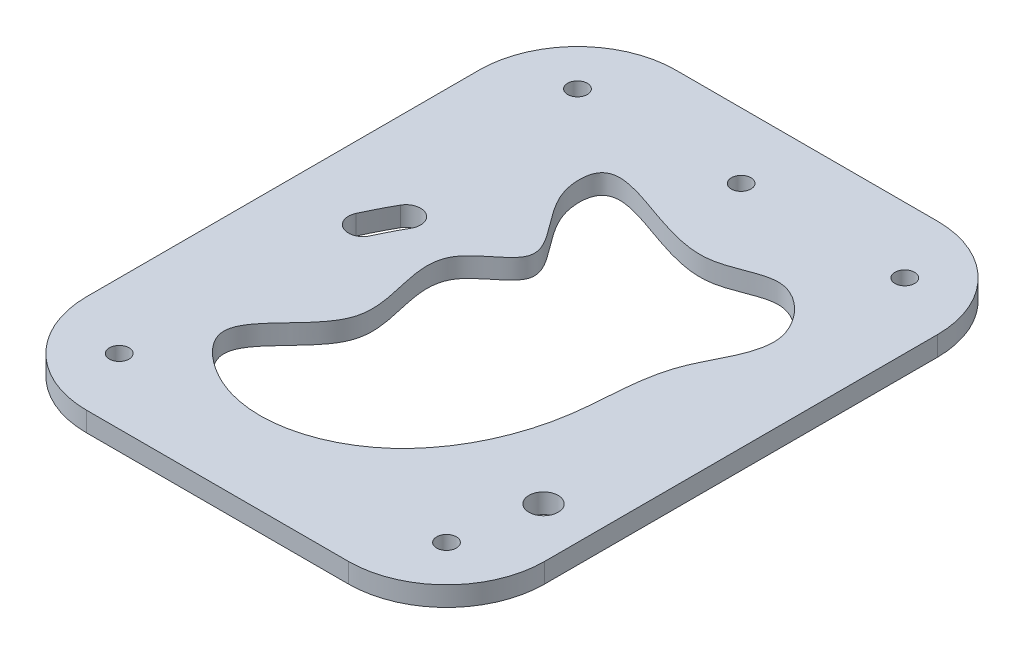
ISO-10303-21;
HEADER;
FILE_DESCRIPTION(('STEP AP214'),'2;1');
FILE_NAME('part.step','',(''),(''),'','','');
FILE_SCHEMA(('AUTOMOTIVE_DESIGN { 1 0 10303 214 1 1 1 1 }'));
ENDSEC;
DATA;
#1=APPLICATION_CONTEXT('core data for automotive mechanical design processes');
#2=APPLICATION_PROTOCOL_DEFINITION('international standard','automotive_design',2000,#1);
#3=PRODUCT_CONTEXT('',#1,'mechanical');
#4=PRODUCT('Part','Part','',(#3));
#5=PRODUCT_RELATED_PRODUCT_CATEGORY('part','',(#4));
#6=PRODUCT_DEFINITION_FORMATION('','',#4);
#7=PRODUCT_DEFINITION_CONTEXT('part definition',#1,'design');
#8=PRODUCT_DEFINITION('design','',#6,#7);
#9=PRODUCT_DEFINITION_SHAPE('','',#8);
#10=(LENGTH_UNIT() NAMED_UNIT(*) SI_UNIT(.MILLI.,.METRE.));
#11=(NAMED_UNIT(*) PLANE_ANGLE_UNIT() SI_UNIT($,.RADIAN.));
#12=(NAMED_UNIT(*) SI_UNIT($,.STERADIAN.) SOLID_ANGLE_UNIT());
#13=UNCERTAINTY_MEASURE_WITH_UNIT(LENGTH_MEASURE(1.E-05),#10,'distance_accuracy_value','');
#14=(GEOMETRIC_REPRESENTATION_CONTEXT(3) GLOBAL_UNCERTAINTY_ASSIGNED_CONTEXT((#13)) GLOBAL_UNIT_ASSIGNED_CONTEXT((#10,
#11,#12)) REPRESENTATION_CONTEXT('',''));
#15=CARTESIAN_POINT('',(0.,0.,0.));
#16=DIRECTION('',(0.,0.,1.));
#17=DIRECTION('',(1.,0.,0.));
#18=AXIS2_PLACEMENT_3D('',#15,#16,#17);
#19=CARTESIAN_POINT('',(-31.0238124460293,3.,28.8725646362015));
#20=DIRECTION('',(0.,1.,0.));
#21=DIRECTION('',(0.,0.,1.));
#22=AXIS2_PLACEMENT_3D('',#19,#20,#21);
#23=PLANE('',#22);
#24=CARTESIAN_POINT('',(-36.0238124460293,3.,33.8725646362015));
#25=DIRECTION('',(0.,1.,0.));
#26=DIRECTION('',(0.,0.,1.));
#27=AXIS2_PLACEMENT_3D('',#24,#25,#26);
#28=CIRCLE('',#27,1.5);
#29=CARTESIAN_POINT('',(-36.0238124460293,3.,35.3725646362015));
#30=VERTEX_POINT('',#29);
#31=EDGE_CURVE('E331',#30,#30,#28,.T.);
#32=ORIENTED_EDGE('',*,*,#31,.F.);
#33=EDGE_LOOP('',(#32));
#34=FACE_BOUND('',#33,.T.);
#35=CARTESIAN_POINT('',(13.9761875539707,3.,-36.1274353637984));
#36=DIRECTION('',(0.,1.,0.));
#37=DIRECTION('',(0.,0.,1.));
#38=AXIS2_PLACEMENT_3D('',#35,#36,#37);
#39=CIRCLE('',#38,1.5);
#40=CARTESIAN_POINT('',(13.9761875539707,3.,-34.6274353637984));
#41=VERTEX_POINT('',#40);
#42=EDGE_CURVE('E339',#41,#41,#39,.T.);
#43=ORIENTED_EDGE('',*,*,#42,.F.);
#44=EDGE_LOOP('',(#43));
#45=FACE_BOUND('',#44,.T.);
#46=CARTESIAN_POINT('',(-11.0238124460293,3.,-36.1274353637985));
#47=DIRECTION('',(0.,1.,0.));
#48=DIRECTION('',(0.,0.,1.));
#49=AXIS2_PLACEMENT_3D('',#46,#47,#48);
#50=CIRCLE('',#49,1.5);
#51=CARTESIAN_POINT('',(-11.0238124460293,3.,-34.6274353637985));
#52=VERTEX_POINT('',#51);
#53=EDGE_CURVE('E153',#52,#52,#50,.T.);
#54=ORIENTED_EDGE('',*,*,#53,.F.);
#55=EDGE_LOOP('',(#54));
#56=FACE_BOUND('',#55,.T.);
#57=CARTESIAN_POINT('',(-31.0238124460293,3.,28.8725646362015));
#58=DIRECTION('',(0.,1.,0.));
#59=DIRECTION('',(0.,0.,1.));
#60=AXIS2_PLACEMENT_3D('',#57,#58,#59);
#61=CIRCLE('',#60,15.);
#62=CARTESIAN_POINT('',(-46.0238124460293,3.,28.8725646362015));
#63=VERTEX_POINT('',#62);
#64=CARTESIAN_POINT('',(-31.0238124460293,3.,43.8725646362015));
#65=VERTEX_POINT('',#64);
#66=EDGE_CURVE('E251',#63,#65,#61,.T.);
#67=ORIENTED_EDGE('',*,*,#66,.T.);
#68=DIRECTION('',(1.,0.,0.));
#69=VECTOR('',#68,1.);
#70=CARTESIAN_POINT('',(-31.0238124460293,3.,43.8725646362015));
#71=LINE('',#70,#69);
#72=CARTESIAN_POINT('',(8.97618755397071,3.,43.8725646362015));
#73=VERTEX_POINT('',#72);
#74=EDGE_CURVE('E277',#65,#73,#71,.T.);
#75=ORIENTED_EDGE('',*,*,#74,.T.);
#76=CARTESIAN_POINT('',(8.97618755397071,3.,28.8725646362015));
#77=DIRECTION('',(0.,1.,0.));
#78=DIRECTION('',(0.,0.,1.));
#79=AXIS2_PLACEMENT_3D('',#76,#77,#78);
#80=CIRCLE('',#79,15.);
#81=CARTESIAN_POINT('',(23.9761875539707,3.,28.8725646362015));
#82=VERTEX_POINT('',#81);
#83=EDGE_CURVE('E233',#73,#82,#80,.T.);
#84=ORIENTED_EDGE('',*,*,#83,.T.);
#85=DIRECTION('',(0.,0.,-1.));
#86=VECTOR('',#85,1.);
#87=CARTESIAN_POINT('',(23.9761875539707,3.,28.8725646362015));
#88=LINE('',#87,#86);
#89=CARTESIAN_POINT('',(23.9761875539707,3.,-31.1274353637984));
#90=VERTEX_POINT('',#89);
#91=EDGE_CURVE('E270',#82,#90,#88,.T.);
#92=ORIENTED_EDGE('',*,*,#91,.T.);
#93=CARTESIAN_POINT('',(8.97618755397071,3.,-31.1274353637985));
#94=DIRECTION('',(0.,1.,0.));
#95=DIRECTION('',(0.,0.,1.));
#96=AXIS2_PLACEMENT_3D('',#93,#94,#95);
#97=CIRCLE('',#96,15.);
#98=CARTESIAN_POINT('',(8.97618755397071,3.,-46.1274353637985));
#99=VERTEX_POINT('',#98);
#100=EDGE_CURVE('E273',#90,#99,#97,.T.);
#101=ORIENTED_EDGE('',*,*,#100,.T.);
#102=DIRECTION('',(-1.,0.,0.));
#103=VECTOR('',#102,1.);
#104=CARTESIAN_POINT('',(8.97618755397071,3.,-46.1274353637985));
#105=LINE('',#104,#103);
#106=CARTESIAN_POINT('',(-31.0238124460293,3.,-46.1274353637985));
#107=VERTEX_POINT('',#106);
#108=EDGE_CURVE('E275',#99,#107,#105,.T.);
#109=ORIENTED_EDGE('',*,*,#108,.T.);
#110=CARTESIAN_POINT('',(-31.0238124460293,3.,-31.1274353637985));
#111=DIRECTION('',(0.,1.,0.));
#112=DIRECTION('',(0.,0.,1.));
#113=AXIS2_PLACEMENT_3D('',#110,#111,#112);
#114=CIRCLE('',#113,15.);
#115=CARTESIAN_POINT('',(-46.0238124460293,3.,-31.1274353637984));
#116=VERTEX_POINT('',#115);
#117=EDGE_CURVE('E282',#107,#116,#114,.T.);
#118=ORIENTED_EDGE('',*,*,#117,.T.);
#119=DIRECTION('',(0.,0.,1.));
#120=VECTOR('',#119,1.);
#121=CARTESIAN_POINT('',(-46.0238124460293,3.,-31.1274353637984));
#122=LINE('',#121,#120);
#123=EDGE_CURVE('E256',#116,#63,#122,.T.);
#124=ORIENTED_EDGE('',*,*,#123,.T.);
#125=EDGE_LOOP('',(#67,#75,#84,#92,#101,#109,#118,#124));
#126=FACE_BOUND('',#125,.T.);
#127=CARTESIAN_POINT('',(12.3196540881497,3.,-18.9841404140265));
#128=CARTESIAN_POINT('',(11.6629701829106,3.,-22.0954766543908));
#129=CARTESIAN_POINT('',(5.53254197715122,3.,-28.706311429523));
#130=CARTESIAN_POINT('',(-6.04783060887376,3.,-19.023530048639));
#131=CARTESIAN_POINT('',(-24.1676788178805,3.,-32.7029871863925));
#132=CARTESIAN_POINT('',(-23.8805449533189,3.,-18.2256639939239));
#133=CARTESIAN_POINT('',(-13.17876092245,3.,-10.9301605159709));
#134=CARTESIAN_POINT('',(-28.3375776723587,3.,-3.55026242595452));
#135=CARTESIAN_POINT('',(-16.9380472853086,3.,11.926125950816));
#136=CARTESIAN_POINT('',(-35.1792757951743,3.,21.2686056415766));
#137=CARTESIAN_POINT('',(-21.7912946511003,3.,33.6255903396624));
#138=CARTESIAN_POINT('',(-1.66320243992105,3.,29.7412369855877));
#139=CARTESIAN_POINT('',(7.78706179828892,3.,9.87669181426671));
#140=CARTESIAN_POINT('',(6.54543872929986,3.,-6.73716468577534));
#141=CARTESIAN_POINT('',(13.1470602856606,3.,-15.0639302988103));
#142=CARTESIAN_POINT('',(12.3196540881497,3.,-18.9841404140265));
#143=B_SPLINE_CURVE_WITH_KNOTS('',3,(#127,#128,#129,#130,#131,#132,#133,#134,#135,#136,#137,
#138,#139,#140,#141,#142),.UNSPECIFIED.,.T.,.F.,(4,1,1,1,1,1,1,1,1,1,1,1,1,4),(0.,
0.0549171396351497,0.111470451044166,0.226544887515455,0.252267236526532,0.325912219798813,
0.370316863142387,0.460932615476568,0.54577793209302,0.58993056292155,0.713238033763596,
0.843820618845198,0.930805702224183,1.),.UNSPECIFIED.);
#144=CARTESIAN_POINT('',(12.3196540881497,3.,-18.9841404140265));
#145=VERTEX_POINT('',#144);
#146=EDGE_CURVE('E163',#145,#145,#143,.T.);
#147=ORIENTED_EDGE('',*,*,#146,.F.);
#148=EDGE_LOOP('',(#147));
#149=FACE_BOUND('',#148,.T.);
#150=CARTESIAN_POINT('',(-34.4402539512089,3.,-1.79475419961807));
#151=DIRECTION('',(0.,1.,0.));
#152=DIRECTION('',(0.,0.,1.));
#153=AXIS2_PLACEMENT_3D('',#150,#151,#152);
#154=CIRCLE('',#153,2.23703467091141);
#155=CARTESIAN_POINT('',(-36.475278055949,3.,-2.72373267729488));
#156=VERTEX_POINT('',#155);
#157=CARTESIAN_POINT('',(-32.4052298464689,3.,-0.865775721941256));
#158=VERTEX_POINT('',#157);
#159=EDGE_CURVE('E132',#156,#158,#154,.T.);
#160=ORIENTED_EDGE('',*,*,#159,.F.);
#161=CARTESIAN_POINT('',(16.2753631621524,3.,21.3566751474207));
#162=DIRECTION('',(0.,1.,0.));
#163=DIRECTION('',(0.,0.,1.));
#164=AXIS2_PLACEMENT_3D('',#161,#162,#163);
#165=CIRCLE('',#164,57.9870346709114);
#166=CARTESIAN_POINT('',(-34.1758001106304,3.,-7.2296207712268));
#167=VERTEX_POINT('',#166);
#168=EDGE_CURVE('E124',#167,#156,#165,.T.);
#169=ORIENTED_EDGE('',*,*,#168,.F.);
#170=CARTESIAN_POINT('',(-32.2294856962181,3.,-6.12681329976579));
#171=DIRECTION('',(0.,1.,0.));
#172=DIRECTION('',(0.,0.,1.));
#173=AXIS2_PLACEMENT_3D('',#170,#171,#172);
#174=CIRCLE('',#173,2.23703467091139);
#175=CARTESIAN_POINT('',(-30.2831712818056,3.,-5.02400582830486));
#176=VERTEX_POINT('',#175);
#177=EDGE_CURVE('E147',#176,#167,#174,.T.);
#178=ORIENTED_EDGE('',*,*,#177,.F.);
#179=CARTESIAN_POINT('',(16.2753631621524,3.,21.3566751474207));
#180=DIRECTION('',(0.,-1.,0.));
#181=DIRECTION('',(0.,0.,1.));
#182=AXIS2_PLACEMENT_3D('',#179,#180,#181);
#183=CIRCLE('',#182,53.5129653290886);
#184=EDGE_CURVE('E145',#158,#176,#183,.T.);
#185=ORIENTED_EDGE('',*,*,#184,.F.);
#186=EDGE_LOOP('',(#160,#169,#178,#185));
#187=FACE_BOUND('',#186,.T.);
#188=CARTESIAN_POINT('',(-36.0238124460293,3.,-36.1274353637985));
#189=DIRECTION('',(0.,1.,0.));
#190=DIRECTION('',(0.,0.,1.));
#191=AXIS2_PLACEMENT_3D('',#188,#189,#190);
#192=CIRCLE('',#191,1.5);
#193=CARTESIAN_POINT('',(-36.0238124460293,3.,-34.6274353637985));
#194=VERTEX_POINT('',#193);
#195=EDGE_CURVE('E343',#194,#194,#192,.T.);
#196=ORIENTED_EDGE('',*,*,#195,.F.);
#197=EDGE_LOOP('',(#196));
#198=FACE_BOUND('',#197,.T.);
#199=CARTESIAN_POINT('',(13.9761875539707,3.,33.8725646362015));
#200=DIRECTION('',(0.,1.,0.));
#201=DIRECTION('',(0.,0.,1.));
#202=AXIS2_PLACEMENT_3D('',#199,#200,#201);
#203=CIRCLE('',#202,1.5);
#204=CARTESIAN_POINT('',(13.9761875539707,3.,35.3725646362015));
#205=VERTEX_POINT('',#204);
#206=EDGE_CURVE('E335',#205,#205,#203,.T.);
#207=ORIENTED_EDGE('',*,*,#206,.F.);
#208=EDGE_LOOP('',(#207));
#209=FACE_BOUND('',#208,.T.);
#210=CARTESIAN_POINT('',(16.2753631621524,3.,21.3566751474207));
#211=DIRECTION('',(0.,1.,0.));
#212=DIRECTION('',(0.,0.,1.));
#213=AXIS2_PLACEMENT_3D('',#210,#211,#212);
#214=CIRCLE('',#213,2.23703467091135);
#215=CARTESIAN_POINT('',(16.2753631621524,3.,23.593709818332));
#216=VERTEX_POINT('',#215);
#217=EDGE_CURVE('E326',#216,#216,#214,.T.);
#218=ORIENTED_EDGE('',*,*,#217,.F.);
#219=EDGE_LOOP('',(#218));
#220=FACE_BOUND('',#219,.T.);
#221=ADVANCED_FACE('F35',(#34,#45,#56,#126,#149,#187,#198,#209,#220),#23,.T.);
#222=CARTESIAN_POINT('',(-31.0238124460293,0.,28.8725646362015));
#223=DIRECTION('',(0.,1.,0.));
#224=DIRECTION('',(0.,0.,1.));
#225=AXIS2_PLACEMENT_3D('',#222,#223,#224);
#226=PLANE('',#225);
#227=CARTESIAN_POINT('',(12.3196540881497,0.,-18.9841404140265));
#228=CARTESIAN_POINT('',(11.6629701829106,0.,-22.0954766543908));
#229=CARTESIAN_POINT('',(5.53254197715122,0.,-28.706311429523));
#230=CARTESIAN_POINT('',(-6.04783060887376,0.,-19.023530048639));
#231=CARTESIAN_POINT('',(-24.1676788178805,0.,-32.7029871863925));
#232=CARTESIAN_POINT('',(-23.8805449533189,0.,-18.2256639939239));
#233=CARTESIAN_POINT('',(-13.17876092245,0.,-10.9301605159709));
#234=CARTESIAN_POINT('',(-28.3375776723587,0.,-3.55026242595452));
#235=CARTESIAN_POINT('',(-16.9380472853086,0.,11.926125950816));
#236=CARTESIAN_POINT('',(-35.1792757951743,0.,21.2686056415766));
#237=CARTESIAN_POINT('',(-21.7912946511003,0.,33.6255903396624));
#238=CARTESIAN_POINT('',(-1.66320243992105,0.,29.7412369855877));
#239=CARTESIAN_POINT('',(7.78706179828892,0.,9.87669181426671));
#240=CARTESIAN_POINT('',(6.54543872929986,0.,-6.73716468577534));
#241=CARTESIAN_POINT('',(13.1470602856606,0.,-15.0639302988103));
#242=CARTESIAN_POINT('',(12.3196540881497,0.,-18.9841404140265));
#243=B_SPLINE_CURVE_WITH_KNOTS('',3,(#227,#228,#229,#230,#231,#232,#233,#234,#235,#236,#237,
#238,#239,#240,#241,#242),.UNSPECIFIED.,.T.,.F.,(4,1,1,1,1,1,1,1,1,1,1,1,1,4),(0.,
0.0549171396351497,0.111470451044166,0.226544887515455,0.252267236526532,0.325912219798813,
0.370316863142387,0.460932615476568,0.54577793209302,0.58993056292155,0.713238033763596,
0.843820618845198,0.930805702224183,1.),.UNSPECIFIED.);
#244=CARTESIAN_POINT('',(12.3196540881497,0.,-18.9841404140265));
#245=VERTEX_POINT('',#244);
#246=EDGE_CURVE('E140',#245,#245,#243,.T.);
#247=ORIENTED_EDGE('',*,*,#246,.T.);
#248=EDGE_LOOP('',(#247));
#249=FACE_BOUND('',#248,.T.);
#250=CARTESIAN_POINT('',(-31.0238124460293,0.,28.8725646362015));
#251=DIRECTION('',(0.,1.,0.));
#252=DIRECTION('',(0.,0.,1.));
#253=AXIS2_PLACEMENT_3D('',#250,#251,#252);
#254=CIRCLE('',#253,15.);
#255=CARTESIAN_POINT('',(-46.0238124460293,0.,28.8725646362015));
#256=VERTEX_POINT('',#255);
#257=CARTESIAN_POINT('',(-31.0238124460293,0.,43.8725646362015));
#258=VERTEX_POINT('',#257);
#259=EDGE_CURVE('E169',#256,#258,#254,.T.);
#260=ORIENTED_EDGE('',*,*,#259,.F.);
#261=DIRECTION('',(0.,0.,1.));
#262=VECTOR('',#261,1.);
#263=CARTESIAN_POINT('',(-46.0238124460293,0.,-31.1274353637984));
#264=LINE('',#263,#262);
#265=CARTESIAN_POINT('',(-46.0238124460293,0.,-31.1274353637984));
#266=VERTEX_POINT('',#265);
#267=EDGE_CURVE('E249',#266,#256,#264,.T.);
#268=ORIENTED_EDGE('',*,*,#267,.F.);
#269=CARTESIAN_POINT('',(-31.0238124460293,0.,-31.1274353637985));
#270=DIRECTION('',(0.,1.,0.));
#271=DIRECTION('',(0.,0.,1.));
#272=AXIS2_PLACEMENT_3D('',#269,#270,#271);
#273=CIRCLE('',#272,15.);
#274=CARTESIAN_POINT('',(-31.0238124460293,0.,-46.1274353637985));
#275=VERTEX_POINT('',#274);
#276=EDGE_CURVE('E247',#275,#266,#273,.T.);
#277=ORIENTED_EDGE('',*,*,#276,.F.);
#278=DIRECTION('',(-1.,0.,0.));
#279=VECTOR('',#278,1.);
#280=CARTESIAN_POINT('',(8.97618755397071,0.,-46.1274353637985));
#281=LINE('',#280,#279);
#282=CARTESIAN_POINT('',(8.97618755397071,0.,-46.1274353637985));
#283=VERTEX_POINT('',#282);
#284=EDGE_CURVE('E245',#283,#275,#281,.T.);
#285=ORIENTED_EDGE('',*,*,#284,.F.);
#286=CARTESIAN_POINT('',(8.97618755397071,0.,-31.1274353637985));
#287=DIRECTION('',(0.,1.,0.));
#288=DIRECTION('',(0.,0.,1.));
#289=AXIS2_PLACEMENT_3D('',#286,#287,#288);
#290=CIRCLE('',#289,15.);
#291=CARTESIAN_POINT('',(23.9761875539707,0.,-31.1274353637984));
#292=VERTEX_POINT('',#291);
#293=EDGE_CURVE('E240',#292,#283,#290,.T.);
#294=ORIENTED_EDGE('',*,*,#293,.F.);
#295=DIRECTION('',(0.,0.,-1.));
#296=VECTOR('',#295,1.);
#297=CARTESIAN_POINT('',(23.9761875539707,0.,28.8725646362015));
#298=LINE('',#297,#296);
#299=CARTESIAN_POINT('',(23.9761875539707,0.,28.8725646362015));
#300=VERTEX_POINT('',#299);
#301=EDGE_CURVE('E238',#300,#292,#298,.T.);
#302=ORIENTED_EDGE('',*,*,#301,.F.);
#303=CARTESIAN_POINT('',(8.97618755397071,0.,28.8725646362015));
#304=DIRECTION('',(0.,1.,0.));
#305=DIRECTION('',(0.,0.,1.));
#306=AXIS2_PLACEMENT_3D('',#303,#304,#305);
#307=CIRCLE('',#306,15.);
#308=CARTESIAN_POINT('',(8.97618755397071,0.,43.8725646362015));
#309=VERTEX_POINT('',#308);
#310=EDGE_CURVE('E229',#309,#300,#307,.T.);
#311=ORIENTED_EDGE('',*,*,#310,.F.);
#312=DIRECTION('',(1.,0.,0.));
#313=VECTOR('',#312,1.);
#314=CARTESIAN_POINT('',(-31.0238124460293,0.,43.8725646362015));
#315=LINE('',#314,#313);
#316=EDGE_CURVE('E221',#258,#309,#315,.T.);
#317=ORIENTED_EDGE('',*,*,#316,.F.);
#318=EDGE_LOOP('',(#260,#268,#277,#285,#294,#302,#311,#317));
#319=FACE_BOUND('',#318,.T.);
#320=CARTESIAN_POINT('',(16.2753631621524,0.,21.3566751474207));
#321=DIRECTION('',(0.,1.,0.));
#322=DIRECTION('',(0.,0.,1.));
#323=AXIS2_PLACEMENT_3D('',#320,#321,#322);
#324=CIRCLE('',#323,57.9870346709114);
#325=CARTESIAN_POINT('',(-34.1758001106304,0.,-7.2296207712268));
#326=VERTEX_POINT('',#325);
#327=CARTESIAN_POINT('',(-36.475278055949,0.,-2.72373267729488));
#328=VERTEX_POINT('',#327);
#329=EDGE_CURVE('E58',#326,#328,#324,.T.);
#330=ORIENTED_EDGE('',*,*,#329,.T.);
#331=CARTESIAN_POINT('',(-34.4402539512089,0.,-1.79475419961807));
#332=DIRECTION('',(0.,1.,0.));
#333=DIRECTION('',(0.,0.,1.));
#334=AXIS2_PLACEMENT_3D('',#331,#332,#333);
#335=CIRCLE('',#334,2.23703467091141);
#336=CARTESIAN_POINT('',(-32.4052298464689,0.,-0.865775721941256));
#337=VERTEX_POINT('',#336);
#338=EDGE_CURVE('E139',#328,#337,#335,.T.);
#339=ORIENTED_EDGE('',*,*,#338,.T.);
#340=CARTESIAN_POINT('',(16.2753631621524,0.,21.3566751474207));
#341=DIRECTION('',(0.,-1.,0.));
#342=DIRECTION('',(0.,0.,1.));
#343=AXIS2_PLACEMENT_3D('',#340,#341,#342);
#344=CIRCLE('',#343,53.5129653290886);
#345=CARTESIAN_POINT('',(-30.2831712818056,0.,-5.02400582830486));
#346=VERTEX_POINT('',#345);
#347=EDGE_CURVE('E155',#337,#346,#344,.T.);
#348=ORIENTED_EDGE('',*,*,#347,.T.);
#349=CARTESIAN_POINT('',(-32.2294856962181,0.,-6.12681329976579));
#350=DIRECTION('',(0.,1.,0.));
#351=DIRECTION('',(0.,0.,1.));
#352=AXIS2_PLACEMENT_3D('',#349,#350,#351);
#353=CIRCLE('',#352,2.23703467091139);
#354=EDGE_CURVE('E133',#346,#326,#353,.T.);
#355=ORIENTED_EDGE('',*,*,#354,.T.);
#356=EDGE_LOOP('',(#330,#339,#348,#355));
#357=FACE_BOUND('',#356,.T.);
#358=CARTESIAN_POINT('',(-11.0238124460293,0.,-36.1274353637985));
#359=DIRECTION('',(0.,1.,0.));
#360=DIRECTION('',(0.,0.,1.));
#361=AXIS2_PLACEMENT_3D('',#358,#359,#360);
#362=CIRCLE('',#361,1.5);
#363=CARTESIAN_POINT('',(-11.0238124460293,0.,-34.6274353637985));
#364=VERTEX_POINT('',#363);
#365=EDGE_CURVE('E305',#364,#364,#362,.T.);
#366=ORIENTED_EDGE('',*,*,#365,.T.);
#367=EDGE_LOOP('',(#366));
#368=FACE_BOUND('',#367,.T.);
#369=CARTESIAN_POINT('',(-36.0238124460293,0.,-36.1274353637985));
#370=DIRECTION('',(0.,1.,0.));
#371=DIRECTION('',(0.,0.,1.));
#372=AXIS2_PLACEMENT_3D('',#369,#370,#371);
#373=CIRCLE('',#372,1.5);
#374=CARTESIAN_POINT('',(-36.0238124460293,0.,-34.6274353637985));
#375=VERTEX_POINT('',#374);
#376=EDGE_CURVE('E309',#375,#375,#373,.T.);
#377=ORIENTED_EDGE('',*,*,#376,.T.);
#378=EDGE_LOOP('',(#377));
#379=FACE_BOUND('',#378,.T.);
#380=CARTESIAN_POINT('',(13.9761875539707,0.,-36.1274353637984));
#381=DIRECTION('',(0.,1.,0.));
#382=DIRECTION('',(0.,0.,1.));
#383=AXIS2_PLACEMENT_3D('',#380,#381,#382);
#384=CIRCLE('',#383,1.5);
#385=CARTESIAN_POINT('',(13.9761875539707,0.,-34.6274353637984));
#386=VERTEX_POINT('',#385);
#387=EDGE_CURVE('E313',#386,#386,#384,.T.);
#388=ORIENTED_EDGE('',*,*,#387,.T.);
#389=EDGE_LOOP('',(#388));
#390=FACE_BOUND('',#389,.T.);
#391=CARTESIAN_POINT('',(13.9761875539707,0.,33.8725646362015));
#392=DIRECTION('',(0.,1.,0.));
#393=DIRECTION('',(0.,0.,1.));
#394=AXIS2_PLACEMENT_3D('',#391,#392,#393);
#395=CIRCLE('',#394,1.5);
#396=CARTESIAN_POINT('',(13.9761875539707,0.,35.3725646362015));
#397=VERTEX_POINT('',#396);
#398=EDGE_CURVE('E317',#397,#397,#395,.T.);
#399=ORIENTED_EDGE('',*,*,#398,.T.);
#400=EDGE_LOOP('',(#399));
#401=FACE_BOUND('',#400,.T.);
#402=CARTESIAN_POINT('',(-36.0238124460293,0.,33.8725646362015));
#403=DIRECTION('',(0.,1.,0.));
#404=DIRECTION('',(0.,0.,1.));
#405=AXIS2_PLACEMENT_3D('',#402,#403,#404);
#406=CIRCLE('',#405,1.5);
#407=CARTESIAN_POINT('',(-36.0238124460293,0.,35.3725646362015));
#408=VERTEX_POINT('',#407);
#409=EDGE_CURVE('E321',#408,#408,#406,.T.);
#410=ORIENTED_EDGE('',*,*,#409,.T.);
#411=EDGE_LOOP('',(#410));
#412=FACE_BOUND('',#411,.T.);
#413=CARTESIAN_POINT('',(16.2753631621524,0.,21.3566751474207));
#414=DIRECTION('',(0.,1.,0.));
#415=DIRECTION('',(0.,0.,1.));
#416=AXIS2_PLACEMENT_3D('',#413,#414,#415);
#417=CIRCLE('',#416,2.23703467091135);
#418=CARTESIAN_POINT('',(16.2753631621524,0.,23.593709818332));
#419=VERTEX_POINT('',#418);
#420=EDGE_CURVE('E324',#419,#419,#417,.T.);
#421=ORIENTED_EDGE('',*,*,#420,.T.);
#422=EDGE_LOOP('',(#421));
#423=FACE_BOUND('',#422,.T.);
#424=ADVANCED_FACE('F186',(#249,#319,#357,#368,#379,#390,#401,#412,#423),#226,.F.);
#425=CARTESIAN_POINT('',(-31.0238124460293,3.,28.8725646362015));
#426=DIRECTION('',(0.,-1.,0.));
#427=DIRECTION('',(0.,0.,-1.));
#428=AXIS2_PLACEMENT_3D('',#425,#426,#427);
#429=CYLINDRICAL_SURFACE('',#428,15.);
#430=ORIENTED_EDGE('',*,*,#259,.T.);
#431=DIRECTION('',(0.,-1.,0.));
#432=VECTOR('',#431,1.);
#433=CARTESIAN_POINT('',(-31.0238124460293,3.,43.8725646362015));
#434=LINE('',#433,#432);
#435=EDGE_CURVE('E11',#65,#258,#434,.T.);
#436=ORIENTED_EDGE('',*,*,#435,.F.);
#437=ORIENTED_EDGE('',*,*,#66,.F.);
#438=DIRECTION('',(0.,-1.,0.));
#439=VECTOR('',#438,1.);
#440=CARTESIAN_POINT('',(-46.0238124460293,3.,28.8725646362015));
#441=LINE('',#440,#439);
#442=EDGE_CURVE('E252',#63,#256,#441,.T.);
#443=ORIENTED_EDGE('',*,*,#442,.T.);
#444=EDGE_LOOP('',(#430,#436,#437,#443));
#445=FACE_BOUND('',#444,.T.);
#446=ADVANCED_FACE('F37',(#445),#429,.T.);
#447=CARTESIAN_POINT('',(-31.0238124460293,3.,43.8725646362015));
#448=DIRECTION('',(0.,0.,-1.));
#449=DIRECTION('',(-1.,0.,0.));
#450=AXIS2_PLACEMENT_3D('',#447,#448,#449);
#451=PLANE('',#450);
#452=ORIENTED_EDGE('',*,*,#316,.T.);
#453=DIRECTION('',(0.,-1.,0.));
#454=VECTOR('',#453,1.);
#455=CARTESIAN_POINT('',(8.97618755397071,3.,43.8725646362015));
#456=LINE('',#455,#454);
#457=EDGE_CURVE('E43',#73,#309,#456,.T.);
#458=ORIENTED_EDGE('',*,*,#457,.F.);
#459=ORIENTED_EDGE('',*,*,#74,.F.);
#460=ORIENTED_EDGE('',*,*,#435,.T.);
#461=EDGE_LOOP('',(#452,#458,#459,#460));
#462=FACE_BOUND('',#461,.T.);
#463=ADVANCED_FACE('F212',(#462),#451,.F.);
#464=CARTESIAN_POINT('',(8.97618755397071,3.,28.8725646362015));
#465=DIRECTION('',(0.,-1.,0.));
#466=DIRECTION('',(0.,0.,-1.));
#467=AXIS2_PLACEMENT_3D('',#464,#465,#466);
#468=CYLINDRICAL_SURFACE('',#467,15.);
#469=ORIENTED_EDGE('',*,*,#310,.T.);
#470=DIRECTION('',(0.,-1.,0.));
#471=VECTOR('',#470,1.);
#472=CARTESIAN_POINT('',(23.9761875539707,3.,28.8725646362015));
#473=LINE('',#472,#471);
#474=EDGE_CURVE('E234',#82,#300,#473,.T.);
#475=ORIENTED_EDGE('',*,*,#474,.F.);
#476=ORIENTED_EDGE('',*,*,#83,.F.);
#477=ORIENTED_EDGE('',*,*,#457,.T.);
#478=EDGE_LOOP('',(#469,#475,#476,#477));
#479=FACE_BOUND('',#478,.T.);
#480=ADVANCED_FACE('F209',(#479),#468,.T.);
#481=CARTESIAN_POINT('',(23.9761875539707,3.,28.8725646362015));
#482=DIRECTION('',(-1.,0.,0.));
#483=DIRECTION('',(0.,0.,1.));
#484=AXIS2_PLACEMENT_3D('',#481,#482,#483);
#485=PLANE('',#484);
#486=ORIENTED_EDGE('',*,*,#301,.T.);
#487=DIRECTION('',(0.,-1.,0.));
#488=VECTOR('',#487,1.);
#489=CARTESIAN_POINT('',(23.9761875539707,3.,-31.1274353637984));
#490=LINE('',#489,#488);
#491=EDGE_CURVE('E265',#90,#292,#490,.T.);
#492=ORIENTED_EDGE('',*,*,#491,.F.);
#493=ORIENTED_EDGE('',*,*,#91,.F.);
#494=ORIENTED_EDGE('',*,*,#474,.T.);
#495=EDGE_LOOP('',(#486,#492,#493,#494));
#496=FACE_BOUND('',#495,.T.);
#497=ADVANCED_FACE('F205',(#496),#485,.F.);
#498=CARTESIAN_POINT('',(8.97618755397071,3.,-31.1274353637985));
#499=DIRECTION('',(0.,-1.,0.));
#500=DIRECTION('',(0.,0.,-1.));
#501=AXIS2_PLACEMENT_3D('',#498,#499,#500);
#502=CYLINDRICAL_SURFACE('',#501,15.);
#503=ORIENTED_EDGE('',*,*,#293,.T.);
#504=DIRECTION('',(0.,-1.,0.));
#505=VECTOR('',#504,1.);
#506=CARTESIAN_POINT('',(8.97618755397071,3.,-46.1274353637985));
#507=LINE('',#506,#505);
#508=EDGE_CURVE('E262',#99,#283,#507,.T.);
#509=ORIENTED_EDGE('',*,*,#508,.F.);
#510=ORIENTED_EDGE('',*,*,#100,.F.);
#511=ORIENTED_EDGE('',*,*,#491,.T.);
#512=EDGE_LOOP('',(#503,#509,#510,#511));
#513=FACE_BOUND('',#512,.T.);
#514=ADVANCED_FACE('F201',(#513),#502,.T.);
#515=CARTESIAN_POINT('',(8.97618755397071,3.,-46.1274353637985));
#516=DIRECTION('',(0.,0.,1.));
#517=DIRECTION('',(1.,0.,0.));
#518=AXIS2_PLACEMENT_3D('',#515,#516,#517);
#519=PLANE('',#518);
#520=ORIENTED_EDGE('',*,*,#284,.T.);
#521=DIRECTION('',(0.,-1.,0.));
#522=VECTOR('',#521,1.);
#523=CARTESIAN_POINT('',(-31.0238124460293,3.,-46.1274353637985));
#524=LINE('',#523,#522);
#525=EDGE_CURVE('E259',#107,#275,#524,.T.);
#526=ORIENTED_EDGE('',*,*,#525,.F.);
#527=ORIENTED_EDGE('',*,*,#108,.F.);
#528=ORIENTED_EDGE('',*,*,#508,.T.);
#529=EDGE_LOOP('',(#520,#526,#527,#528));
#530=FACE_BOUND('',#529,.T.);
#531=ADVANCED_FACE('F197',(#530),#519,.F.);
#532=CARTESIAN_POINT('',(-31.0238124460293,3.,-31.1274353637985));
#533=DIRECTION('',(0.,-1.,0.));
#534=DIRECTION('',(0.,0.,-1.));
#535=AXIS2_PLACEMENT_3D('',#532,#533,#534);
#536=CYLINDRICAL_SURFACE('',#535,15.);
#537=ORIENTED_EDGE('',*,*,#276,.T.);
#538=DIRECTION('',(0.,-1.,0.));
#539=VECTOR('',#538,1.);
#540=CARTESIAN_POINT('',(-46.0238124460293,3.,-31.1274353637984));
#541=LINE('',#540,#539);
#542=EDGE_CURVE('E255',#116,#266,#541,.T.);
#543=ORIENTED_EDGE('',*,*,#542,.F.);
#544=ORIENTED_EDGE('',*,*,#117,.F.);
#545=ORIENTED_EDGE('',*,*,#525,.T.);
#546=EDGE_LOOP('',(#537,#543,#544,#545));
#547=FACE_BOUND('',#546,.T.);
#548=ADVANCED_FACE('F193',(#547),#536,.T.);
#549=CARTESIAN_POINT('',(-46.0238124460293,3.,-31.1274353637984));
#550=DIRECTION('',(1.,0.,0.));
#551=DIRECTION('',(0.,0.,-1.));
#552=AXIS2_PLACEMENT_3D('',#549,#550,#551);
#553=PLANE('',#552);
#554=ORIENTED_EDGE('',*,*,#267,.T.);
#555=ORIENTED_EDGE('',*,*,#442,.F.);
#556=ORIENTED_EDGE('',*,*,#123,.F.);
#557=ORIENTED_EDGE('',*,*,#542,.T.);
#558=EDGE_LOOP('',(#554,#555,#556,#557));
#559=FACE_BOUND('',#558,.T.);
#560=ADVANCED_FACE('F181',(#559),#553,.F.);
#561=DIRECTION('',(0.,-1.,0.));
#562=VECTOR('',#561,1.);
#563=SURFACE_OF_LINEAR_EXTRUSION('',#143,#562);
#564=ORIENTED_EDGE('',*,*,#146,.T.);
#565=EDGE_LOOP('',(#564));
#566=FACE_BOUND('',#565,.T.);
#567=ORIENTED_EDGE('',*,*,#246,.F.);
#568=EDGE_LOOP('',(#567));
#569=FACE_BOUND('',#568,.T.);
#570=ADVANCED_FACE('F177',(#566,#569),#563,.T.);
#571=CARTESIAN_POINT('',(16.2753631621524,3.,21.3566751474207));
#572=DIRECTION('',(0.,-1.,0.));
#573=DIRECTION('',(0.,0.,-1.));
#574=AXIS2_PLACEMENT_3D('',#571,#572,#573);
#575=CYLINDRICAL_SURFACE('',#574,57.9870346709114);
#576=ORIENTED_EDGE('',*,*,#329,.F.);
#577=DIRECTION('',(0.,-1.,0.));
#578=VECTOR('',#577,1.);
#579=CARTESIAN_POINT('',(-34.1758001106304,3.,-7.2296207712268));
#580=LINE('',#579,#578);
#581=EDGE_CURVE('E128',#167,#326,#580,.T.);
#582=ORIENTED_EDGE('',*,*,#581,.F.);
#583=ORIENTED_EDGE('',*,*,#168,.T.);
#584=DIRECTION('',(0.,-1.,0.));
#585=VECTOR('',#584,1.);
#586=CARTESIAN_POINT('',(-36.475278055949,3.,-2.72373267729488));
#587=LINE('',#586,#585);
#588=EDGE_CURVE('E127',#156,#328,#587,.T.);
#589=ORIENTED_EDGE('',*,*,#588,.T.);
#590=EDGE_LOOP('',(#576,#582,#583,#589));
#591=FACE_BOUND('',#590,.T.);
#592=ADVANCED_FACE('F126',(#591),#575,.F.);
#593=CARTESIAN_POINT('',(-34.4402539512089,3.,-1.79475419961807));
#594=DIRECTION('',(0.,-1.,0.));
#595=DIRECTION('',(0.,0.,-1.));
#596=AXIS2_PLACEMENT_3D('',#593,#594,#595);
#597=CYLINDRICAL_SURFACE('',#596,2.23703467091141);
#598=ORIENTED_EDGE('',*,*,#338,.F.);
#599=ORIENTED_EDGE('',*,*,#588,.F.);
#600=ORIENTED_EDGE('',*,*,#159,.T.);
#601=DIRECTION('',(0.,-1.,0.));
#602=VECTOR('',#601,1.);
#603=CARTESIAN_POINT('',(-32.4052298464689,3.,-0.865775721941256));
#604=LINE('',#603,#602);
#605=EDGE_CURVE('E141',#158,#337,#604,.T.);
#606=ORIENTED_EDGE('',*,*,#605,.T.);
#607=EDGE_LOOP('',(#598,#599,#600,#606));
#608=FACE_BOUND('',#607,.T.);
#609=ADVANCED_FACE('F136',(#608),#597,.F.);
#610=CARTESIAN_POINT('',(16.2753631621524,3.,21.3566751474207));
#611=DIRECTION('',(0.,-1.,0.));
#612=DIRECTION('',(0.,0.,-1.));
#613=AXIS2_PLACEMENT_3D('',#610,#611,#612);
#614=CYLINDRICAL_SURFACE('',#613,53.5129653290886);
#615=ORIENTED_EDGE('',*,*,#347,.F.);
#616=ORIENTED_EDGE('',*,*,#605,.F.);
#617=ORIENTED_EDGE('',*,*,#184,.T.);
#618=DIRECTION('',(0.,-1.,0.));
#619=VECTOR('',#618,1.);
#620=CARTESIAN_POINT('',(-30.2831712818056,3.,-5.02400582830486));
#621=LINE('',#620,#619);
#622=EDGE_CURVE('E50',#176,#346,#621,.T.);
#623=ORIENTED_EDGE('',*,*,#622,.T.);
#624=EDGE_LOOP('',(#615,#616,#617,#623));
#625=FACE_BOUND('',#624,.T.);
#626=ADVANCED_FACE('F364',(#625),#614,.T.);
#627=CARTESIAN_POINT('',(-32.2294856962181,3.,-6.12681329976579));
#628=DIRECTION('',(0.,-1.,0.));
#629=DIRECTION('',(0.,0.,-1.));
#630=AXIS2_PLACEMENT_3D('',#627,#628,#629);
#631=CYLINDRICAL_SURFACE('',#630,2.23703467091139);
#632=ORIENTED_EDGE('',*,*,#354,.F.);
#633=ORIENTED_EDGE('',*,*,#622,.F.);
#634=ORIENTED_EDGE('',*,*,#177,.T.);
#635=ORIENTED_EDGE('',*,*,#581,.T.);
#636=EDGE_LOOP('',(#632,#633,#634,#635));
#637=FACE_BOUND('',#636,.T.);
#638=ADVANCED_FACE('F355',(#637),#631,.F.);
#639=CARTESIAN_POINT('',(-11.0238124460293,3.,-36.1274353637985));
#640=DIRECTION('',(0.,-1.,0.));
#641=DIRECTION('',(0.,0.,-1.));
#642=AXIS2_PLACEMENT_3D('',#639,#640,#641);
#643=CYLINDRICAL_SURFACE('',#642,1.5);
#644=ORIENTED_EDGE('',*,*,#53,.T.);
#645=EDGE_LOOP('',(#644));
#646=FACE_BOUND('',#645,.T.);
#647=ORIENTED_EDGE('',*,*,#365,.F.);
#648=EDGE_LOOP('',(#647));
#649=FACE_BOUND('',#648,.T.);
#650=ADVANCED_FACE('F350',(#646,#649),#643,.F.);
#651=CARTESIAN_POINT('',(-36.0238124460293,3.,-36.1274353637985));
#652=DIRECTION('',(0.,-1.,0.));
#653=DIRECTION('',(0.,0.,-1.));
#654=AXIS2_PLACEMENT_3D('',#651,#652,#653);
#655=CYLINDRICAL_SURFACE('',#654,1.5);
#656=ORIENTED_EDGE('',*,*,#195,.T.);
#657=EDGE_LOOP('',(#656));
#658=FACE_BOUND('',#657,.T.);
#659=ORIENTED_EDGE('',*,*,#376,.F.);
#660=EDGE_LOOP('',(#659));
#661=FACE_BOUND('',#660,.T.);
#662=ADVANCED_FACE('F354',(#658,#661),#655,.F.);
#663=CARTESIAN_POINT('',(13.9761875539707,3.,-36.1274353637984));
#664=DIRECTION('',(0.,-1.,0.));
#665=DIRECTION('',(0.,0.,-1.));
#666=AXIS2_PLACEMENT_3D('',#663,#664,#665);
#667=CYLINDRICAL_SURFACE('',#666,1.5);
#668=ORIENTED_EDGE('',*,*,#42,.T.);
#669=EDGE_LOOP('',(#668));
#670=FACE_BOUND('',#669,.T.);
#671=ORIENTED_EDGE('',*,*,#387,.F.);
#672=EDGE_LOOP('',(#671));
#673=FACE_BOUND('',#672,.T.);
#674=ADVANCED_FACE('F361',(#670,#673),#667,.F.);
#675=CARTESIAN_POINT('',(13.9761875539707,3.,33.8725646362015));
#676=DIRECTION('',(0.,-1.,0.));
#677=DIRECTION('',(0.,0.,-1.));
#678=AXIS2_PLACEMENT_3D('',#675,#676,#677);
#679=CYLINDRICAL_SURFACE('',#678,1.5);
#680=ORIENTED_EDGE('',*,*,#206,.T.);
#681=EDGE_LOOP('',(#680));
#682=FACE_BOUND('',#681,.T.);
#683=ORIENTED_EDGE('',*,*,#398,.F.);
#684=EDGE_LOOP('',(#683));
#685=FACE_BOUND('',#684,.T.);
#686=ADVANCED_FACE('F473',(#682,#685),#679,.F.);
#687=CARTESIAN_POINT('',(-36.0238124460293,3.,33.8725646362015));
#688=DIRECTION('',(0.,-1.,0.));
#689=DIRECTION('',(0.,0.,-1.));
#690=AXIS2_PLACEMENT_3D('',#687,#688,#689);
#691=CYLINDRICAL_SURFACE('',#690,1.5);
#692=ORIENTED_EDGE('',*,*,#31,.T.);
#693=EDGE_LOOP('',(#692));
#694=FACE_BOUND('',#693,.T.);
#695=ORIENTED_EDGE('',*,*,#409,.F.);
#696=EDGE_LOOP('',(#695));
#697=FACE_BOUND('',#696,.T.);
#698=ADVANCED_FACE('F481',(#694,#697),#691,.F.);
#699=CARTESIAN_POINT('',(16.2753631621524,3.,21.3566751474207));
#700=DIRECTION('',(0.,-1.,0.));
#701=DIRECTION('',(0.,0.,-1.));
#702=AXIS2_PLACEMENT_3D('',#699,#700,#701);
#703=CYLINDRICAL_SURFACE('',#702,2.23703467091135);
#704=ORIENTED_EDGE('',*,*,#217,.T.);
#705=EDGE_LOOP('',(#704));
#706=FACE_BOUND('',#705,.T.);
#707=ORIENTED_EDGE('',*,*,#420,.F.);
#708=EDGE_LOOP('',(#707));
#709=FACE_BOUND('',#708,.T.);
#710=ADVANCED_FACE('F490',(#706,#709),#703,.F.);
#711=CLOSED_SHELL('',(#221,#424,#446,#463,#480,#497,#514,#531,#548,#560,#570,#592,#609,#626,
#638,#650,#662,#674,#686,#698,#710));
#712=MANIFOLD_SOLID_BREP('B2',#711);
#713=ADVANCED_BREP_SHAPE_REPRESENTATION('',(#18,#712),#14);
#714=SHAPE_DEFINITION_REPRESENTATION(#9,#713);
ENDSEC;
END-ISO-10303-21;
